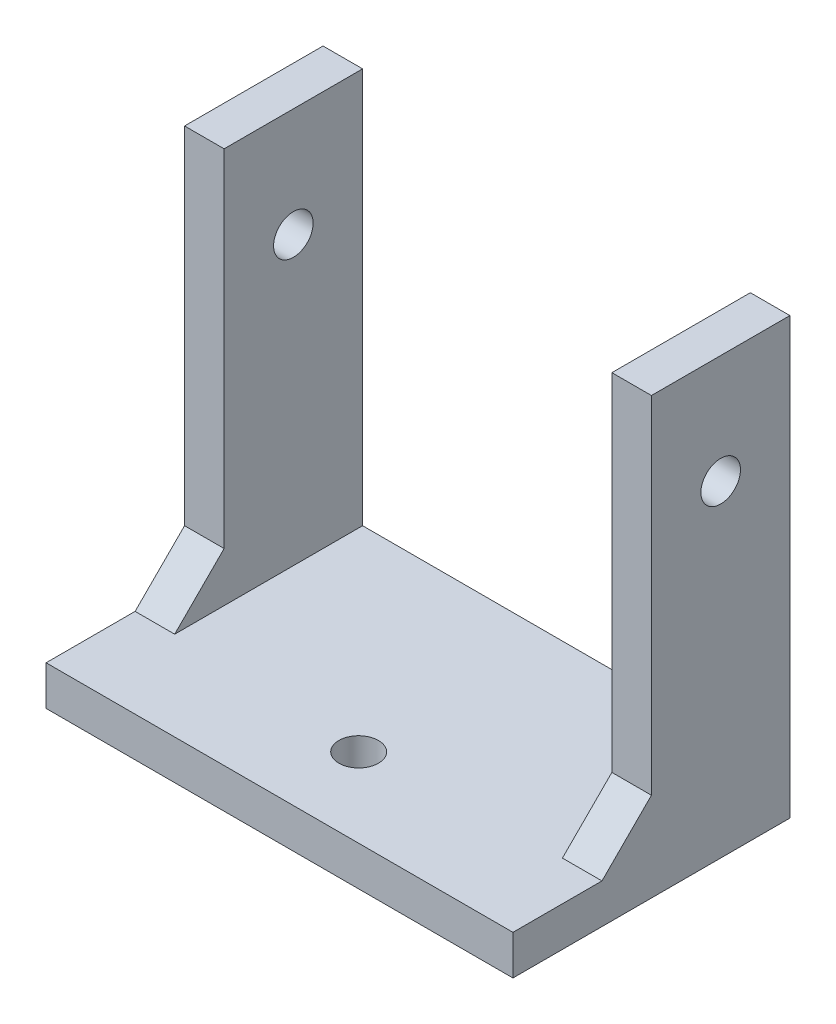
ISO-10303-21;
HEADER;
FILE_DESCRIPTION(('STEP AP214'),'2;1');
FILE_NAME('part.step','',(''),(''),'','','');
FILE_SCHEMA(('AUTOMOTIVE_DESIGN { 1 0 10303 214 1 1 1 1 }'));
ENDSEC;
DATA;
#1=APPLICATION_CONTEXT('core data for automotive mechanical design processes');
#2=APPLICATION_PROTOCOL_DEFINITION('international standard','automotive_design',2000,#1);
#3=PRODUCT_CONTEXT('',#1,'mechanical');
#4=PRODUCT('Part','Part','',(#3));
#5=PRODUCT_RELATED_PRODUCT_CATEGORY('part','',(#4));
#6=PRODUCT_DEFINITION_FORMATION('','',#4);
#7=PRODUCT_DEFINITION_CONTEXT('part definition',#1,'design');
#8=PRODUCT_DEFINITION('design','',#6,#7);
#9=PRODUCT_DEFINITION_SHAPE('','',#8);
#10=(LENGTH_UNIT() NAMED_UNIT(*) SI_UNIT(.MILLI.,.METRE.));
#11=(NAMED_UNIT(*) PLANE_ANGLE_UNIT() SI_UNIT($,.RADIAN.));
#12=(NAMED_UNIT(*) SI_UNIT($,.STERADIAN.) SOLID_ANGLE_UNIT());
#13=UNCERTAINTY_MEASURE_WITH_UNIT(LENGTH_MEASURE(1.E-05),#10,'distance_accuracy_value','');
#14=(GEOMETRIC_REPRESENTATION_CONTEXT(3) GLOBAL_UNCERTAINTY_ASSIGNED_CONTEXT((#13)) GLOBAL_UNIT_ASSIGNED_CONTEXT((#10,
#11,#12)) REPRESENTATION_CONTEXT('',''));
#15=CARTESIAN_POINT('',(0.,0.,0.));
#16=DIRECTION('',(0.,0.,1.));
#17=DIRECTION('',(1.,0.,0.));
#18=AXIS2_PLACEMENT_3D('',#15,#16,#17);
#19=CARTESIAN_POINT('',(0.,2.,0.));
#20=DIRECTION('',(0.,1.,0.));
#21=DIRECTION('',(0.,0.,1.));
#22=AXIS2_PLACEMENT_3D('',#19,#20,#21);
#23=PLANE('',#22);
#24=CARTESIAN_POINT('',(0.,2.,3.));
#25=DIRECTION('',(0.,-1.,0.));
#26=DIRECTION('',(0.,0.,-1.));
#27=AXIS2_PLACEMENT_3D('',#24,#25,#26);
#28=CIRCLE('',#27,1.);
#29=CARTESIAN_POINT('',(0.,2.,2.));
#30=VERTEX_POINT('',#29);
#31=EDGE_CURVE('E175',#30,#30,#28,.T.);
#32=ORIENTED_EDGE('',*,*,#31,.T.);
#33=EDGE_LOOP('',(#32));
#34=FACE_BOUND('',#33,.T.);
#35=DIRECTION('',(-1.,0.,0.));
#36=VECTOR('',#35,1.);
#37=CARTESIAN_POINT('',(11.8,2.,-7.));
#38=LINE('',#37,#36);
#39=CARTESIAN_POINT('',(9.80000000000001,2.,-7.));
#40=VERTEX_POINT('',#39);
#41=CARTESIAN_POINT('',(-9.8,2.,-7.));
#42=VERTEX_POINT('',#41);
#43=EDGE_CURVE('E220',#40,#42,#38,.T.);
#44=ORIENTED_EDGE('',*,*,#43,.T.);
#45=DIRECTION('',(0.,0.,1.));
#46=VECTOR('',#45,1.);
#47=CARTESIAN_POINT('',(-9.8,2.,-7.));
#48=LINE('',#47,#46);
#49=CARTESIAN_POINT('',(-9.8,2.,2.5));
#50=VERTEX_POINT('',#49);
#51=EDGE_CURVE('E153',#42,#50,#48,.T.);
#52=ORIENTED_EDGE('',*,*,#51,.T.);
#53=DIRECTION('',(-1.,0.,0.));
#54=VECTOR('',#53,1.);
#55=CARTESIAN_POINT('',(-9.8,2.,2.5));
#56=LINE('',#55,#54);
#57=CARTESIAN_POINT('',(-11.8,2.,2.5));
#58=VERTEX_POINT('',#57);
#59=EDGE_CURVE('E142',#50,#58,#56,.T.);
#60=ORIENTED_EDGE('',*,*,#59,.T.);
#61=DIRECTION('',(0.,0.,1.));
#62=VECTOR('',#61,1.);
#63=CARTESIAN_POINT('',(-11.8,2.,7.));
#64=LINE('',#63,#62);
#65=CARTESIAN_POINT('',(-11.8,2.,7.));
#66=VERTEX_POINT('',#65);
#67=EDGE_CURVE('E207',#58,#66,#64,.T.);
#68=ORIENTED_EDGE('',*,*,#67,.T.);
#69=DIRECTION('',(1.,0.,0.));
#70=VECTOR('',#69,1.);
#71=CARTESIAN_POINT('',(11.8,2.,7.));
#72=LINE('',#71,#70);
#73=CARTESIAN_POINT('',(11.8,2.,7.));
#74=VERTEX_POINT('',#73);
#75=EDGE_CURVE('E211',#66,#74,#72,.T.);
#76=ORIENTED_EDGE('',*,*,#75,.T.);
#77=DIRECTION('',(0.,0.,-1.));
#78=VECTOR('',#77,1.);
#79=CARTESIAN_POINT('',(11.8,2.,7.));
#80=LINE('',#79,#78);
#81=CARTESIAN_POINT('',(11.8,2.,2.5));
#82=VERTEX_POINT('',#81);
#83=EDGE_CURVE('E212',#74,#82,#80,.T.);
#84=ORIENTED_EDGE('',*,*,#83,.T.);
#85=DIRECTION('',(1.,0.,0.));
#86=VECTOR('',#85,1.);
#87=CARTESIAN_POINT('',(9.80000000000001,2.,2.5));
#88=LINE('',#87,#86);
#89=CARTESIAN_POINT('',(9.80000000000001,2.,2.5));
#90=VERTEX_POINT('',#89);
#91=EDGE_CURVE('E199',#90,#82,#88,.T.);
#92=ORIENTED_EDGE('',*,*,#91,.F.);
#93=DIRECTION('',(0.,0.,-1.));
#94=VECTOR('',#93,1.);
#95=CARTESIAN_POINT('',(9.80000000000001,2.,0.));
#96=LINE('',#95,#94);
#97=EDGE_CURVE('E189',#90,#40,#96,.T.);
#98=ORIENTED_EDGE('',*,*,#97,.T.);
#99=EDGE_LOOP('',(#44,#52,#60,#68,#76,#84,#92,#98));
#100=FACE_BOUND('',#99,.T.);
#101=ADVANCED_FACE('F39',(#34,#100),#23,.T.);
#102=CARTESIAN_POINT('',(-11.8,2.,7.));
#103=DIRECTION('',(1.,0.,0.));
#104=DIRECTION('',(0.,0.,-1.));
#105=AXIS2_PLACEMENT_3D('',#102,#103,#104);
#106=PLANE('',#105);
#107=CARTESIAN_POINT('',(-11.8,16.5,-3.5));
#108=DIRECTION('',(1.,0.,0.));
#109=DIRECTION('',(0.,0.,-1.));
#110=AXIS2_PLACEMENT_3D('',#107,#108,#109);
#111=CIRCLE('',#110,1.);
#112=CARTESIAN_POINT('',(-11.8,16.5,-4.5));
#113=VERTEX_POINT('',#112);
#114=EDGE_CURVE('E429',#113,#113,#111,.T.);
#115=ORIENTED_EDGE('',*,*,#114,.T.);
#116=EDGE_LOOP('',(#115));
#117=FACE_BOUND('',#116,.T.);
#118=DIRECTION('',(0.,0.,1.));
#119=VECTOR('',#118,1.);
#120=CARTESIAN_POINT('',(-11.8,0.,7.));
#121=LINE('',#120,#119);
#122=CARTESIAN_POINT('',(-11.8,0.,-7.));
#123=VERTEX_POINT('',#122);
#124=CARTESIAN_POINT('',(-11.8,0.,7.));
#125=VERTEX_POINT('',#124);
#126=EDGE_CURVE('E205',#123,#125,#121,.T.);
#127=ORIENTED_EDGE('',*,*,#126,.T.);
#128=DIRECTION('',(0.,-1.,0.));
#129=VECTOR('',#128,1.);
#130=CARTESIAN_POINT('',(-11.8,2.,7.));
#131=LINE('',#130,#129);
#132=EDGE_CURVE('E11',#66,#125,#131,.T.);
#133=ORIENTED_EDGE('',*,*,#132,.F.);
#134=ORIENTED_EDGE('',*,*,#67,.F.);
#135=DIRECTION('',(0.,0.707106781186547,-0.707106781186548));
#136=VECTOR('',#135,1.);
#137=CARTESIAN_POINT('',(-11.8,2.,2.5));
#138=LINE('',#137,#136);
#139=CARTESIAN_POINT('',(-11.8,4.5,0.));
#140=VERTEX_POINT('',#139);
#141=EDGE_CURVE('E54',#58,#140,#138,.T.);
#142=ORIENTED_EDGE('',*,*,#141,.T.);
#143=DIRECTION('',(0.,1.,0.));
#144=VECTOR('',#143,1.);
#145=CARTESIAN_POINT('',(-11.8,4.5,0.));
#146=LINE('',#145,#144);
#147=CARTESIAN_POINT('',(-11.8,22.,0.));
#148=VERTEX_POINT('',#147);
#149=EDGE_CURVE('E160',#140,#148,#146,.T.);
#150=ORIENTED_EDGE('',*,*,#149,.T.);
#151=DIRECTION('',(0.,0.,-1.));
#152=VECTOR('',#151,1.);
#153=CARTESIAN_POINT('',(-11.8,22.,0.));
#154=LINE('',#153,#152);
#155=CARTESIAN_POINT('',(-11.8,22.,-7.));
#156=VERTEX_POINT('',#155);
#157=EDGE_CURVE('E168',#148,#156,#154,.T.);
#158=ORIENTED_EDGE('',*,*,#157,.T.);
#159=DIRECTION('',(0.,-1.,0.));
#160=VECTOR('',#159,1.);
#161=CARTESIAN_POINT('',(-11.8,2.,-7.));
#162=LINE('',#161,#160);
#163=EDGE_CURVE('E140',#156,#123,#162,.T.);
#164=ORIENTED_EDGE('',*,*,#163,.T.);
#165=EDGE_LOOP('',(#127,#133,#134,#142,#150,#158,#164));
#166=FACE_BOUND('',#165,.T.);
#167=ADVANCED_FACE('F41',(#117,#166),#106,.F.);
#168=CARTESIAN_POINT('',(11.8,2.,7.));
#169=DIRECTION('',(0.,0.,-1.));
#170=DIRECTION('',(-1.,0.,0.));
#171=AXIS2_PLACEMENT_3D('',#168,#169,#170);
#172=PLANE('',#171);
#173=DIRECTION('',(1.,0.,0.));
#174=VECTOR('',#173,1.);
#175=CARTESIAN_POINT('',(11.8,0.,7.));
#176=LINE('',#175,#174);
#177=CARTESIAN_POINT('',(11.8,0.,7.));
#178=VERTEX_POINT('',#177);
#179=EDGE_CURVE('E222',#125,#178,#176,.T.);
#180=ORIENTED_EDGE('',*,*,#179,.T.);
#181=DIRECTION('',(0.,-1.,0.));
#182=VECTOR('',#181,1.);
#183=CARTESIAN_POINT('',(11.8,2.,7.));
#184=LINE('',#183,#182);
#185=EDGE_CURVE('E48',#74,#178,#184,.T.);
#186=ORIENTED_EDGE('',*,*,#185,.F.);
#187=ORIENTED_EDGE('',*,*,#75,.F.);
#188=ORIENTED_EDGE('',*,*,#132,.T.);
#189=EDGE_LOOP('',(#180,#186,#187,#188));
#190=FACE_BOUND('',#189,.T.);
#191=ADVANCED_FACE('F261',(#190),#172,.F.);
#192=CARTESIAN_POINT('',(11.8,2.,7.));
#193=DIRECTION('',(-1.,0.,0.));
#194=DIRECTION('',(0.,0.,1.));
#195=AXIS2_PLACEMENT_3D('',#192,#193,#194);
#196=PLANE('',#195);
#197=CARTESIAN_POINT('',(11.8,16.5,-3.5));
#198=DIRECTION('',(1.,0.,0.));
#199=DIRECTION('',(0.,0.,-1.));
#200=AXIS2_PLACEMENT_3D('',#197,#198,#199);
#201=CIRCLE('',#200,1.);
#202=CARTESIAN_POINT('',(11.8,16.5,-4.5));
#203=VERTEX_POINT('',#202);
#204=EDGE_CURVE('E435',#203,#203,#201,.T.);
#205=ORIENTED_EDGE('',*,*,#204,.F.);
#206=EDGE_LOOP('',(#205));
#207=FACE_BOUND('',#206,.T.);
#208=DIRECTION('',(0.,0.,-1.));
#209=VECTOR('',#208,1.);
#210=CARTESIAN_POINT('',(11.8,0.,7.));
#211=LINE('',#210,#209);
#212=CARTESIAN_POINT('',(11.8,0.,-7.));
#213=VERTEX_POINT('',#212);
#214=EDGE_CURVE('E224',#178,#213,#211,.T.);
#215=ORIENTED_EDGE('',*,*,#214,.T.);
#216=DIRECTION('',(0.,-1.,0.));
#217=VECTOR('',#216,1.);
#218=CARTESIAN_POINT('',(11.8,2.,-7.));
#219=LINE('',#218,#217);
#220=CARTESIAN_POINT('',(11.8,22.,-7.));
#221=VERTEX_POINT('',#220);
#222=EDGE_CURVE('E230',#221,#213,#219,.T.);
#223=ORIENTED_EDGE('',*,*,#222,.F.);
#224=DIRECTION('',(0.,0.,1.));
#225=VECTOR('',#224,1.);
#226=CARTESIAN_POINT('',(11.8,22.,-7.));
#227=LINE('',#226,#225);
#228=CARTESIAN_POINT('',(11.8,22.,0.));
#229=VERTEX_POINT('',#228);
#230=EDGE_CURVE('E174',#221,#229,#227,.T.);
#231=ORIENTED_EDGE('',*,*,#230,.T.);
#232=DIRECTION('',(0.,-1.,0.));
#233=VECTOR('',#232,1.);
#234=CARTESIAN_POINT('',(11.8,4.5,0.));
#235=LINE('',#234,#233);
#236=CARTESIAN_POINT('',(11.8,4.5,0.));
#237=VERTEX_POINT('',#236);
#238=EDGE_CURVE('E194',#229,#237,#235,.T.);
#239=ORIENTED_EDGE('',*,*,#238,.T.);
#240=DIRECTION('',(0.,-0.707106781186547,0.707106781186548));
#241=VECTOR('',#240,1.);
#242=CARTESIAN_POINT('',(11.8,4.5,0.));
#243=LINE('',#242,#241);
#244=EDGE_CURVE('E182',#237,#82,#243,.T.);
#245=ORIENTED_EDGE('',*,*,#244,.T.);
#246=ORIENTED_EDGE('',*,*,#83,.F.);
#247=ORIENTED_EDGE('',*,*,#185,.T.);
#248=EDGE_LOOP('',(#215,#223,#231,#239,#245,#246,#247));
#249=FACE_BOUND('',#248,.T.);
#250=ADVANCED_FACE('F234',(#207,#249),#196,.F.);
#251=CARTESIAN_POINT('',(11.8,2.,-7.));
#252=DIRECTION('',(0.,0.,1.));
#253=DIRECTION('',(1.,0.,0.));
#254=AXIS2_PLACEMENT_3D('',#251,#252,#253);
#255=PLANE('',#254);
#256=DIRECTION('',(-1.,0.,0.));
#257=VECTOR('',#256,1.);
#258=CARTESIAN_POINT('',(11.8,0.,-7.));
#259=LINE('',#258,#257);
#260=EDGE_CURVE('E215',#213,#123,#259,.T.);
#261=ORIENTED_EDGE('',*,*,#260,.T.);
#262=ORIENTED_EDGE('',*,*,#163,.F.);
#263=DIRECTION('',(-1.,0.,0.));
#264=VECTOR('',#263,1.);
#265=CARTESIAN_POINT('',(-9.8,22.,-7.));
#266=LINE('',#265,#264);
#267=CARTESIAN_POINT('',(-9.8,22.,-7.));
#268=VERTEX_POINT('',#267);
#269=EDGE_CURVE('E128',#268,#156,#266,.T.);
#270=ORIENTED_EDGE('',*,*,#269,.F.);
#271=DIRECTION('',(0.,-1.,0.));
#272=VECTOR('',#271,1.);
#273=CARTESIAN_POINT('',(-9.8,22.,-7.));
#274=LINE('',#273,#272);
#275=EDGE_CURVE('E132',#268,#42,#274,.T.);
#276=ORIENTED_EDGE('',*,*,#275,.T.);
#277=ORIENTED_EDGE('',*,*,#43,.F.);
#278=DIRECTION('',(0.,1.,0.));
#279=VECTOR('',#278,1.);
#280=CARTESIAN_POINT('',(9.80000000000001,2.,-7.));
#281=LINE('',#280,#279);
#282=CARTESIAN_POINT('',(9.80000000000001,22.,-7.));
#283=VERTEX_POINT('',#282);
#284=EDGE_CURVE('E61',#40,#283,#281,.T.);
#285=ORIENTED_EDGE('',*,*,#284,.T.);
#286=DIRECTION('',(1.,0.,0.));
#287=VECTOR('',#286,1.);
#288=CARTESIAN_POINT('',(9.80000000000001,22.,-7.));
#289=LINE('',#288,#287);
#290=EDGE_CURVE('E195',#283,#221,#289,.T.);
#291=ORIENTED_EDGE('',*,*,#290,.T.);
#292=ORIENTED_EDGE('',*,*,#222,.T.);
#293=EDGE_LOOP('',(#261,#262,#270,#276,#277,#285,#291,#292));
#294=FACE_BOUND('',#293,.T.);
#295=ADVANCED_FACE('F135',(#294),#255,.F.);
#296=CARTESIAN_POINT('',(0.,0.,0.));
#297=DIRECTION('',(0.,1.,0.));
#298=DIRECTION('',(0.,0.,1.));
#299=AXIS2_PLACEMENT_3D('',#296,#297,#298);
#300=PLANE('',#299);
#301=CARTESIAN_POINT('',(0.,0.,3.));
#302=DIRECTION('',(0.,-1.,0.));
#303=DIRECTION('',(0.,0.,-1.));
#304=AXIS2_PLACEMENT_3D('',#301,#302,#303);
#305=CIRCLE('',#304,1.);
#306=CARTESIAN_POINT('',(0.,0.,2.));
#307=VERTEX_POINT('',#306);
#308=EDGE_CURVE('E165',#307,#307,#305,.T.);
#309=ORIENTED_EDGE('',*,*,#308,.F.);
#310=EDGE_LOOP('',(#309));
#311=FACE_BOUND('',#310,.T.);
#312=ORIENTED_EDGE('',*,*,#126,.F.);
#313=ORIENTED_EDGE('',*,*,#260,.F.);
#314=ORIENTED_EDGE('',*,*,#214,.F.);
#315=ORIENTED_EDGE('',*,*,#179,.F.);
#316=EDGE_LOOP('',(#312,#313,#314,#315));
#317=FACE_BOUND('',#316,.T.);
#318=ADVANCED_FACE('F243',(#311,#317),#300,.F.);
#319=CARTESIAN_POINT('',(9.80000000000001,4.5,0.));
#320=DIRECTION('',(0.,0.707106781186548,0.707106781186547));
#321=DIRECTION('',(0.,-0.707106781186547,0.707106781186548));
#322=AXIS2_PLACEMENT_3D('',#319,#320,#321);
#323=PLANE('',#322);
#324=ORIENTED_EDGE('',*,*,#244,.F.);
#325=DIRECTION('',(1.,0.,0.));
#326=VECTOR('',#325,1.);
#327=CARTESIAN_POINT('',(9.80000000000001,4.5,0.));
#328=LINE('',#327,#326);
#329=CARTESIAN_POINT('',(9.80000000000001,4.5,0.));
#330=VERTEX_POINT('',#329);
#331=EDGE_CURVE('E201',#330,#237,#328,.T.);
#332=ORIENTED_EDGE('',*,*,#331,.F.);
#333=DIRECTION('',(0.,-0.707106781186547,0.707106781186548));
#334=VECTOR('',#333,1.);
#335=CARTESIAN_POINT('',(9.80000000000001,4.5,0.));
#336=LINE('',#335,#334);
#337=EDGE_CURVE('E190',#330,#90,#336,.T.);
#338=ORIENTED_EDGE('',*,*,#337,.T.);
#339=ORIENTED_EDGE('',*,*,#91,.T.);
#340=EDGE_LOOP('',(#324,#332,#338,#339));
#341=FACE_BOUND('',#340,.T.);
#342=ADVANCED_FACE('F257',(#341),#323,.T.);
#343=CARTESIAN_POINT('',(9.80000000000001,4.5,0.));
#344=DIRECTION('',(0.,0.,1.));
#345=DIRECTION('',(0.,-1.,0.));
#346=AXIS2_PLACEMENT_3D('',#343,#344,#345);
#347=PLANE('',#346);
#348=ORIENTED_EDGE('',*,*,#238,.F.);
#349=DIRECTION('',(1.,0.,0.));
#350=VECTOR('',#349,1.);
#351=CARTESIAN_POINT('',(9.80000000000001,22.,0.));
#352=LINE('',#351,#350);
#353=CARTESIAN_POINT('',(9.80000000000001,22.,0.));
#354=VERTEX_POINT('',#353);
#355=EDGE_CURVE('E202',#354,#229,#352,.T.);
#356=ORIENTED_EDGE('',*,*,#355,.F.);
#357=DIRECTION('',(0.,-1.,0.));
#358=VECTOR('',#357,1.);
#359=CARTESIAN_POINT('',(9.80000000000001,4.5,0.));
#360=LINE('',#359,#358);
#361=EDGE_CURVE('E184',#354,#330,#360,.T.);
#362=ORIENTED_EDGE('',*,*,#361,.T.);
#363=ORIENTED_EDGE('',*,*,#331,.T.);
#364=EDGE_LOOP('',(#348,#356,#362,#363));
#365=FACE_BOUND('',#364,.T.);
#366=ADVANCED_FACE('F258',(#365),#347,.T.);
#367=CARTESIAN_POINT('',(9.80000000000001,22.,-7.));
#368=DIRECTION('',(0.,1.,0.));
#369=DIRECTION('',(0.,0.,1.));
#370=AXIS2_PLACEMENT_3D('',#367,#368,#369);
#371=PLANE('',#370);
#372=ORIENTED_EDGE('',*,*,#230,.F.);
#373=ORIENTED_EDGE('',*,*,#290,.F.);
#374=DIRECTION('',(0.,0.,1.));
#375=VECTOR('',#374,1.);
#376=CARTESIAN_POINT('',(9.80000000000001,22.,-7.));
#377=LINE('',#376,#375);
#378=EDGE_CURVE('E179',#283,#354,#377,.T.);
#379=ORIENTED_EDGE('',*,*,#378,.T.);
#380=ORIENTED_EDGE('',*,*,#355,.T.);
#381=EDGE_LOOP('',(#372,#373,#379,#380));
#382=FACE_BOUND('',#381,.T.);
#383=ADVANCED_FACE('F252',(#382),#371,.T.);
#384=CARTESIAN_POINT('',(9.80000000000001,0.,0.));
#385=DIRECTION('',(1.,0.,0.));
#386=DIRECTION('',(0.,0.,-1.));
#387=AXIS2_PLACEMENT_3D('',#384,#385,#386);
#388=PLANE('',#387);
#389=CARTESIAN_POINT('',(9.8,16.5,-3.5));
#390=DIRECTION('',(1.,0.,0.));
#391=DIRECTION('',(0.,0.,-1.));
#392=AXIS2_PLACEMENT_3D('',#389,#390,#391);
#393=CIRCLE('',#392,1.);
#394=CARTESIAN_POINT('',(9.8,16.5,-4.5));
#395=VERTEX_POINT('',#394);
#396=EDGE_CURVE('E426',#395,#395,#393,.T.);
#397=ORIENTED_EDGE('',*,*,#396,.T.);
#398=EDGE_LOOP('',(#397));
#399=FACE_BOUND('',#398,.T.);
#400=ORIENTED_EDGE('',*,*,#284,.F.);
#401=ORIENTED_EDGE('',*,*,#97,.F.);
#402=ORIENTED_EDGE('',*,*,#337,.F.);
#403=ORIENTED_EDGE('',*,*,#361,.F.);
#404=ORIENTED_EDGE('',*,*,#378,.F.);
#405=EDGE_LOOP('',(#400,#401,#402,#403,#404));
#406=FACE_BOUND('',#405,.T.);
#407=ADVANCED_FACE('F297',(#399,#406),#388,.F.);
#408=CARTESIAN_POINT('',(-9.8,22.,0.));
#409=DIRECTION('',(0.,1.,0.));
#410=DIRECTION('',(0.,0.,1.));
#411=AXIS2_PLACEMENT_3D('',#408,#409,#410);
#412=PLANE('',#411);
#413=ORIENTED_EDGE('',*,*,#157,.F.);
#414=DIRECTION('',(-1.,0.,0.));
#415=VECTOR('',#414,1.);
#416=CARTESIAN_POINT('',(-9.8,22.,0.));
#417=LINE('',#416,#415);
#418=CARTESIAN_POINT('',(-9.8,22.,0.));
#419=VERTEX_POINT('',#418);
#420=EDGE_CURVE('E156',#419,#148,#417,.T.);
#421=ORIENTED_EDGE('',*,*,#420,.F.);
#422=DIRECTION('',(0.,0.,-1.));
#423=VECTOR('',#422,1.);
#424=CARTESIAN_POINT('',(-9.8,22.,0.));
#425=LINE('',#424,#423);
#426=EDGE_CURVE('E149',#419,#268,#425,.T.);
#427=ORIENTED_EDGE('',*,*,#426,.T.);
#428=ORIENTED_EDGE('',*,*,#269,.T.);
#429=EDGE_LOOP('',(#413,#421,#427,#428));
#430=FACE_BOUND('',#429,.T.);
#431=ADVANCED_FACE('F154',(#430),#412,.T.);
#432=CARTESIAN_POINT('',(-9.8,4.5,0.));
#433=DIRECTION('',(0.,0.,1.));
#434=DIRECTION('',(0.,-1.,0.));
#435=AXIS2_PLACEMENT_3D('',#432,#433,#434);
#436=PLANE('',#435);
#437=ORIENTED_EDGE('',*,*,#149,.F.);
#438=DIRECTION('',(-1.,0.,0.));
#439=VECTOR('',#438,1.);
#440=CARTESIAN_POINT('',(-9.8,4.5,0.));
#441=LINE('',#440,#439);
#442=CARTESIAN_POINT('',(-9.8,4.5,0.));
#443=VERTEX_POINT('',#442);
#444=EDGE_CURVE('E178',#443,#140,#441,.T.);
#445=ORIENTED_EDGE('',*,*,#444,.F.);
#446=DIRECTION('',(0.,1.,0.));
#447=VECTOR('',#446,1.);
#448=CARTESIAN_POINT('',(-9.8,4.5,0.));
#449=LINE('',#448,#447);
#450=EDGE_CURVE('E141',#443,#419,#449,.T.);
#451=ORIENTED_EDGE('',*,*,#450,.T.);
#452=ORIENTED_EDGE('',*,*,#420,.T.);
#453=EDGE_LOOP('',(#437,#445,#451,#452));
#454=FACE_BOUND('',#453,.T.);
#455=ADVANCED_FACE('F250',(#454),#436,.T.);
#456=CARTESIAN_POINT('',(-9.8,2.,2.5));
#457=DIRECTION('',(0.,0.707106781186548,0.707106781186547));
#458=DIRECTION('',(0.,-0.707106781186547,0.707106781186548));
#459=AXIS2_PLACEMENT_3D('',#456,#457,#458);
#460=PLANE('',#459);
#461=ORIENTED_EDGE('',*,*,#141,.F.);
#462=ORIENTED_EDGE('',*,*,#59,.F.);
#463=DIRECTION('',(0.,0.707106781186547,-0.707106781186548));
#464=VECTOR('',#463,1.);
#465=CARTESIAN_POINT('',(-9.8,2.,2.5));
#466=LINE('',#465,#464);
#467=EDGE_CURVE('E167',#50,#443,#466,.T.);
#468=ORIENTED_EDGE('',*,*,#467,.T.);
#469=ORIENTED_EDGE('',*,*,#444,.T.);
#470=EDGE_LOOP('',(#461,#462,#468,#469));
#471=FACE_BOUND('',#470,.T.);
#472=ADVANCED_FACE('F308',(#471),#460,.T.);
#473=CARTESIAN_POINT('',(-9.8,0.,0.));
#474=DIRECTION('',(-1.,0.,0.));
#475=DIRECTION('',(0.,0.,1.));
#476=AXIS2_PLACEMENT_3D('',#473,#474,#475);
#477=PLANE('',#476);
#478=CARTESIAN_POINT('',(-9.8,16.5,-3.5));
#479=DIRECTION('',(-1.,0.,0.));
#480=DIRECTION('',(0.,0.,1.));
#481=AXIS2_PLACEMENT_3D('',#478,#479,#480);
#482=CIRCLE('',#481,1.);
#483=CARTESIAN_POINT('',(-9.8,16.5,-2.5));
#484=VERTEX_POINT('',#483);
#485=EDGE_CURVE('E43',#484,#484,#482,.T.);
#486=ORIENTED_EDGE('',*,*,#485,.T.);
#487=EDGE_LOOP('',(#486));
#488=FACE_BOUND('',#487,.T.);
#489=ORIENTED_EDGE('',*,*,#426,.F.);
#490=ORIENTED_EDGE('',*,*,#450,.F.);
#491=ORIENTED_EDGE('',*,*,#467,.F.);
#492=ORIENTED_EDGE('',*,*,#51,.F.);
#493=ORIENTED_EDGE('',*,*,#275,.F.);
#494=EDGE_LOOP('',(#489,#490,#491,#492,#493));
#495=FACE_BOUND('',#494,.T.);
#496=ADVANCED_FACE('F150',(#488,#495),#477,.F.);
#497=CARTESIAN_POINT('',(0.,2.,3.));
#498=DIRECTION('',(0.,-1.,0.));
#499=DIRECTION('',(0.,0.,-1.));
#500=AXIS2_PLACEMENT_3D('',#497,#498,#499);
#501=CYLINDRICAL_SURFACE('',#500,1.);
#502=ORIENTED_EDGE('',*,*,#31,.F.);
#503=EDGE_LOOP('',(#502));
#504=FACE_BOUND('',#503,.T.);
#505=ORIENTED_EDGE('',*,*,#308,.T.);
#506=EDGE_LOOP('',(#505));
#507=FACE_BOUND('',#506,.T.);
#508=ADVANCED_FACE('F322',(#504,#507),#501,.F.);
#509=CARTESIAN_POINT('',(-11.8,16.5,-3.5));
#510=DIRECTION('',(1.,0.,0.));
#511=DIRECTION('',(0.,0.,-1.));
#512=AXIS2_PLACEMENT_3D('',#509,#510,#511);
#513=CYLINDRICAL_SURFACE('',#512,1.);
#514=ORIENTED_EDGE('',*,*,#114,.F.);
#515=EDGE_LOOP('',(#514));
#516=FACE_BOUND('',#515,.T.);
#517=ORIENTED_EDGE('',*,*,#485,.F.);
#518=EDGE_LOOP('',(#517));
#519=FACE_BOUND('',#518,.T.);
#520=ADVANCED_FACE('F338',(#516,#519),#513,.F.);
#521=ORIENTED_EDGE('',*,*,#204,.T.);
#522=EDGE_LOOP('',(#521));
#523=FACE_BOUND('',#522,.T.);
#524=ORIENTED_EDGE('',*,*,#396,.F.);
#525=EDGE_LOOP('',(#524));
#526=FACE_BOUND('',#525,.T.);
#527=ADVANCED_FACE('F344',(#523,#526),#513,.F.);
#528=CLOSED_SHELL('',(#101,#167,#191,#250,#295,#318,#342,#366,#383,#407,#431,#455,#472,#496,
#508,#520,#527));
#529=MANIFOLD_SOLID_BREP('B2',#528);
#530=ADVANCED_BREP_SHAPE_REPRESENTATION('',(#18,#529),#14);
#531=SHAPE_DEFINITION_REPRESENTATION(#9,#530);
ENDSEC;
END-ISO-10303-21;
